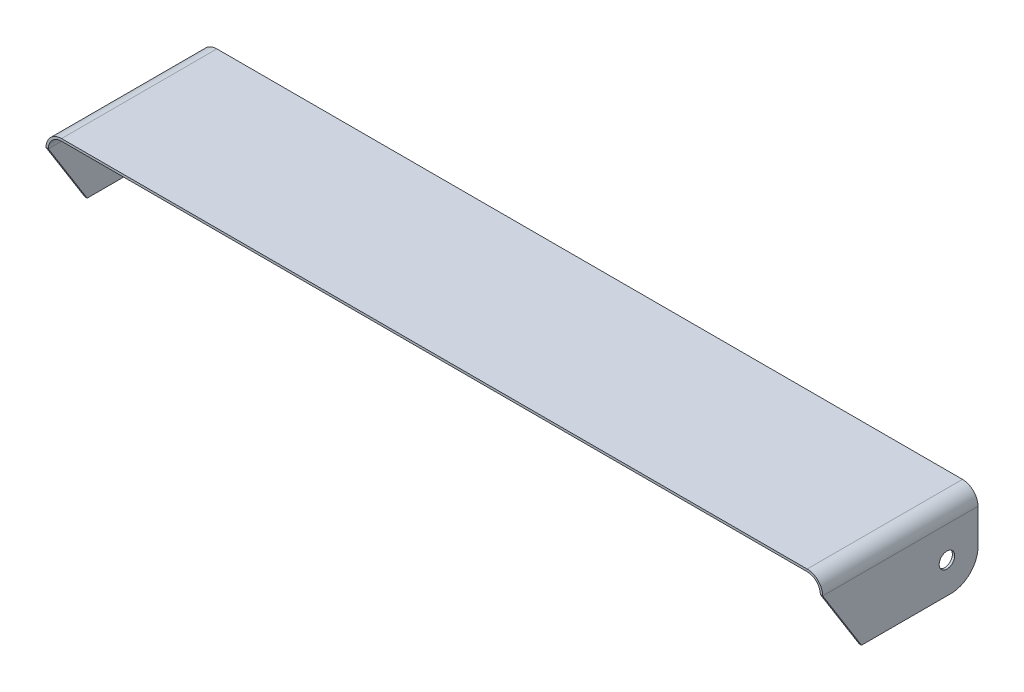
ISO-10303-21;
HEADER;
FILE_DESCRIPTION(('STEP AP214'),'2;1');
FILE_NAME('part.step','',(''),(''),'','','');
FILE_SCHEMA(('AUTOMOTIVE_DESIGN { 1 0 10303 214 1 1 1 1 }'));
ENDSEC;
DATA;
#1=APPLICATION_CONTEXT('core data for automotive mechanical design processes');
#2=APPLICATION_PROTOCOL_DEFINITION('international standard','automotive_design',2000,#1);
#3=PRODUCT_CONTEXT('',#1,'mechanical');
#4=PRODUCT('Part','Part','',(#3));
#5=PRODUCT_RELATED_PRODUCT_CATEGORY('part','',(#4));
#6=PRODUCT_DEFINITION_FORMATION('','',#4);
#7=PRODUCT_DEFINITION_CONTEXT('part definition',#1,'design');
#8=PRODUCT_DEFINITION('design','',#6,#7);
#9=PRODUCT_DEFINITION_SHAPE('','',#8);
#10=(LENGTH_UNIT() NAMED_UNIT(*) SI_UNIT(.MILLI.,.METRE.));
#11=(NAMED_UNIT(*) PLANE_ANGLE_UNIT() SI_UNIT($,.RADIAN.));
#12=(NAMED_UNIT(*) SI_UNIT($,.STERADIAN.) SOLID_ANGLE_UNIT());
#13=UNCERTAINTY_MEASURE_WITH_UNIT(LENGTH_MEASURE(1.E-05),#10,'distance_accuracy_value','');
#14=(GEOMETRIC_REPRESENTATION_CONTEXT(3) GLOBAL_UNCERTAINTY_ASSIGNED_CONTEXT((#13)) GLOBAL_UNIT_ASSIGNED_CONTEXT((#10,
#11,#12)) REPRESENTATION_CONTEXT('',''));
#15=CARTESIAN_POINT('',(0.,0.,0.));
#16=DIRECTION('',(0.,0.,1.));
#17=DIRECTION('',(1.,0.,0.));
#18=AXIS2_PLACEMENT_3D('',#15,#16,#17);
#19=CARTESIAN_POINT('',(-500.,0.,100.));
#20=DIRECTION('',(0.,1.,0.));
#21=DIRECTION('',(0.,0.,1.));
#22=AXIS2_PLACEMENT_3D('',#19,#20,#21);
#23=PLANE('',#22);
#24=DIRECTION('',(0.,0.,-1.));
#25=VECTOR('',#24,1.);
#26=CARTESIAN_POINT('',(-500.,0.,100.));
#27=LINE('',#26,#25);
#28=CARTESIAN_POINT('',(-500.,0.,50.));
#29=VERTEX_POINT('',#28);
#30=CARTESIAN_POINT('',(-500.,0.,-65.));
#31=VERTEX_POINT('',#30);
#32=EDGE_CURVE('E151',#29,#31,#27,.T.);
#33=ORIENTED_EDGE('',*,*,#32,.T.);
#34=DIRECTION('',(1.,0.,0.));
#35=VECTOR('',#34,1.);
#36=CARTESIAN_POINT('',(-497.,0.,-65.));
#37=LINE('',#36,#35);
#38=CARTESIAN_POINT('',(-497.,0.,-65.));
#39=VERTEX_POINT('',#38);
#40=EDGE_CURVE('E210',#31,#39,#37,.T.);
#41=ORIENTED_EDGE('',*,*,#40,.T.);
#42=DIRECTION('',(0.,0.,-1.));
#43=VECTOR('',#42,1.);
#44=CARTESIAN_POINT('',(-497.,0.,100.));
#45=LINE('',#44,#43);
#46=CARTESIAN_POINT('',(-497.,0.,50.));
#47=VERTEX_POINT('',#46);
#48=EDGE_CURVE('E196',#47,#39,#45,.T.);
#49=ORIENTED_EDGE('',*,*,#48,.F.);
#50=DIRECTION('',(1.,0.,0.));
#51=VECTOR('',#50,1.);
#52=CARTESIAN_POINT('',(-500.,0.,50.));
#53=LINE('',#52,#51);
#54=EDGE_CURVE('E226',#29,#47,#53,.T.);
#55=ORIENTED_EDGE('',*,*,#54,.F.);
#56=EDGE_LOOP('',(#33,#41,#49,#55));
#57=FACE_BOUND('',#56,.T.);
#58=ADVANCED_FACE('F33',(#57),#23,.F.);
#59=CARTESIAN_POINT('',(-497.,0.,100.));
#60=DIRECTION('',(-1.,0.,0.));
#61=DIRECTION('',(0.,0.,1.));
#62=AXIS2_PLACEMENT_3D('',#59,#60,#61);
#63=PLANE('',#62);
#64=CARTESIAN_POINT('',(-497.,40.,-60.));
#65=DIRECTION('',(-1.,0.,0.));
#66=DIRECTION('',(0.,0.,1.));
#67=AXIS2_PLACEMENT_3D('',#64,#65,#66);
#68=CIRCLE('',#67,10.);
#69=CARTESIAN_POINT('',(-497.,40.,-50.));
#70=VERTEX_POINT('',#69);
#71=EDGE_CURVE('E327',#70,#70,#68,.T.);
#72=ORIENTED_EDGE('',*,*,#71,.T.);
#73=EDGE_LOOP('',(#72));
#74=FACE_BOUND('',#73,.T.);
#75=ORIENTED_EDGE('',*,*,#48,.T.);
#76=CARTESIAN_POINT('',(-497.,35.,-65.));
#77=DIRECTION('',(-1.,0.,0.));
#78=DIRECTION('',(0.,0.,1.));
#79=AXIS2_PLACEMENT_3D('',#76,#77,#78);
#80=CIRCLE('',#79,35.);
#81=CARTESIAN_POINT('',(-497.,35.,-100.));
#82=VERTEX_POINT('',#81);
#83=EDGE_CURVE('E55',#39,#82,#80,.F.);
#84=ORIENTED_EDGE('',*,*,#83,.T.);
#85=DIRECTION('',(0.,1.,0.));
#86=VECTOR('',#85,1.);
#87=CARTESIAN_POINT('',(-497.,0.,-100.));
#88=LINE('',#87,#86);
#89=CARTESIAN_POINT('',(-497.,79.9999999999999,-100.));
#90=VERTEX_POINT('',#89);
#91=EDGE_CURVE('E220',#82,#90,#88,.T.);
#92=ORIENTED_EDGE('',*,*,#91,.T.);
#93=DIRECTION('',(0.,0.,-1.));
#94=VECTOR('',#93,1.);
#95=CARTESIAN_POINT('',(-497.,79.9999999999999,100.));
#96=LINE('',#95,#94);
#97=CARTESIAN_POINT('',(-497.,79.9999999999999,100.));
#98=VERTEX_POINT('',#97);
#99=EDGE_CURVE('E193',#98,#90,#96,.T.);
#100=ORIENTED_EDGE('',*,*,#99,.F.);
#101=DIRECTION('',(0.,-0.847998304005088,-0.52999894000318));
#102=VECTOR('',#101,1.);
#103=CARTESIAN_POINT('',(-497.,22.4719101123596,64.0449438202247));
#104=LINE('',#103,#102);
#105=EDGE_CURVE('E138',#98,#47,#104,.T.);
#106=ORIENTED_EDGE('',*,*,#105,.T.);
#107=EDGE_LOOP('',(#75,#84,#92,#100,#106));
#108=FACE_BOUND('',#107,.T.);
#109=ADVANCED_FACE('F218',(#74,#108),#63,.F.);
#110=CARTESIAN_POINT('',(-480.,80.,100.));
#111=DIRECTION('',(0.,0.,-1.));
#112=DIRECTION('',(-1.,0.,0.));
#113=AXIS2_PLACEMENT_3D('',#110,#111,#112);
#114=CYLINDRICAL_SURFACE('',#113,17.);
#115=CARTESIAN_POINT('',(-480.,80.,-100.));
#116=DIRECTION('',(0.,0.,-1.));
#117=DIRECTION('',(-1.,0.,0.));
#118=AXIS2_PLACEMENT_3D('',#115,#116,#117);
#119=CIRCLE('',#118,17.);
#120=CARTESIAN_POINT('',(-480.,97.,-100.));
#121=VERTEX_POINT('',#120);
#122=EDGE_CURVE('E223',#90,#121,#119,.T.);
#123=ORIENTED_EDGE('',*,*,#122,.T.);
#124=DIRECTION('',(0.,0.,-1.));
#125=VECTOR('',#124,1.);
#126=CARTESIAN_POINT('',(-480.,97.,100.));
#127=LINE('',#126,#125);
#128=CARTESIAN_POINT('',(-480.,97.,100.));
#129=VERTEX_POINT('',#128);
#130=EDGE_CURVE('E190',#129,#121,#127,.T.);
#131=ORIENTED_EDGE('',*,*,#130,.F.);
#132=CARTESIAN_POINT('',(-480.,80.,100.));
#133=DIRECTION('',(0.,0.,-1.));
#134=DIRECTION('',(-1.,0.,0.));
#135=AXIS2_PLACEMENT_3D('',#132,#133,#134);
#136=CIRCLE('',#135,17.);
#137=EDGE_CURVE('E229',#98,#129,#136,.T.);
#138=ORIENTED_EDGE('',*,*,#137,.F.);
#139=ORIENTED_EDGE('',*,*,#99,.T.);
#140=EDGE_LOOP('',(#123,#131,#138,#139));
#141=FACE_BOUND('',#140,.T.);
#142=ADVANCED_FACE('F266',(#141),#114,.F.);
#143=CARTESIAN_POINT('',(-480.,97.,100.));
#144=DIRECTION('',(0.,1.,0.));
#145=DIRECTION('',(-1.,0.,0.));
#146=AXIS2_PLACEMENT_3D('',#143,#144,#145);
#147=PLANE('',#146);
#148=DIRECTION('',(1.,0.,0.));
#149=VECTOR('',#148,1.);
#150=CARTESIAN_POINT('',(-480.,97.,-100.));
#151=LINE('',#150,#149);
#152=CARTESIAN_POINT('',(480.,97.,-100.));
#153=VERTEX_POINT('',#152);
#154=EDGE_CURVE('E241',#121,#153,#151,.T.);
#155=ORIENTED_EDGE('',*,*,#154,.T.);
#156=DIRECTION('',(0.,0.,-1.));
#157=VECTOR('',#156,1.);
#158=CARTESIAN_POINT('',(480.,97.,100.));
#159=LINE('',#158,#157);
#160=CARTESIAN_POINT('',(480.,97.,100.));
#161=VERTEX_POINT('',#160);
#162=EDGE_CURVE('E187',#161,#153,#159,.T.);
#163=ORIENTED_EDGE('',*,*,#162,.F.);
#164=DIRECTION('',(1.,0.,0.));
#165=VECTOR('',#164,1.);
#166=CARTESIAN_POINT('',(-480.,97.,100.));
#167=LINE('',#166,#165);
#168=EDGE_CURVE('E231',#129,#161,#167,.T.);
#169=ORIENTED_EDGE('',*,*,#168,.F.);
#170=ORIENTED_EDGE('',*,*,#130,.T.);
#171=EDGE_LOOP('',(#155,#163,#169,#170));
#172=FACE_BOUND('',#171,.T.);
#173=ADVANCED_FACE('F272',(#172),#147,.F.);
#174=CARTESIAN_POINT('',(480.,80.,100.));
#175=DIRECTION('',(0.,0.,-1.));
#176=DIRECTION('',(-1.,0.,0.));
#177=AXIS2_PLACEMENT_3D('',#174,#175,#176);
#178=CYLINDRICAL_SURFACE('',#177,17.);
#179=CARTESIAN_POINT('',(480.,80.,-100.));
#180=DIRECTION('',(0.,0.,-1.));
#181=DIRECTION('',(-1.,0.,0.));
#182=AXIS2_PLACEMENT_3D('',#179,#180,#181);
#183=CIRCLE('',#182,17.);
#184=CARTESIAN_POINT('',(497.,79.9999999999999,-100.));
#185=VERTEX_POINT('',#184);
#186=EDGE_CURVE('E243',#153,#185,#183,.T.);
#187=ORIENTED_EDGE('',*,*,#186,.T.);
#188=DIRECTION('',(0.,0.,-1.));
#189=VECTOR('',#188,1.);
#190=CARTESIAN_POINT('',(497.,79.9999999999999,100.));
#191=LINE('',#190,#189);
#192=CARTESIAN_POINT('',(497.,80.,100.));
#193=VERTEX_POINT('',#192);
#194=EDGE_CURVE('E184',#193,#185,#191,.T.);
#195=ORIENTED_EDGE('',*,*,#194,.F.);
#196=CARTESIAN_POINT('',(480.,80.,100.));
#197=DIRECTION('',(0.,0.,-1.));
#198=DIRECTION('',(-1.,0.,0.));
#199=AXIS2_PLACEMENT_3D('',#196,#197,#198);
#200=CIRCLE('',#199,17.);
#201=EDGE_CURVE('E234',#161,#193,#200,.T.);
#202=ORIENTED_EDGE('',*,*,#201,.F.);
#203=ORIENTED_EDGE('',*,*,#162,.T.);
#204=EDGE_LOOP('',(#187,#195,#202,#203));
#205=FACE_BOUND('',#204,.T.);
#206=ADVANCED_FACE('F276',(#205),#178,.F.);
#207=CARTESIAN_POINT('',(497.,79.9999999999999,100.));
#208=DIRECTION('',(1.,0.,0.));
#209=DIRECTION('',(0.,0.,-1.));
#210=AXIS2_PLACEMENT_3D('',#207,#208,#209);
#211=PLANE('',#210);
#212=CARTESIAN_POINT('',(497.,40.,-60.));
#213=DIRECTION('',(1.,0.,0.));
#214=DIRECTION('',(0.,0.,-1.));
#215=AXIS2_PLACEMENT_3D('',#212,#213,#214);
#216=CIRCLE('',#215,10.);
#217=CARTESIAN_POINT('',(497.,40.,-70.));
#218=VERTEX_POINT('',#217);
#219=EDGE_CURVE('E328',#218,#218,#216,.T.);
#220=ORIENTED_EDGE('',*,*,#219,.T.);
#221=EDGE_LOOP('',(#220));
#222=FACE_BOUND('',#221,.T.);
#223=DIRECTION('',(0.,-1.,0.));
#224=VECTOR('',#223,1.);
#225=CARTESIAN_POINT('',(497.,79.9999999999999,-100.));
#226=LINE('',#225,#224);
#227=CARTESIAN_POINT('',(497.,35.,-100.));
#228=VERTEX_POINT('',#227);
#229=EDGE_CURVE('E245',#185,#228,#226,.T.);
#230=ORIENTED_EDGE('',*,*,#229,.T.);
#231=CARTESIAN_POINT('',(497.,35.,-65.));
#232=DIRECTION('',(1.,0.,0.));
#233=DIRECTION('',(0.,0.,-1.));
#234=AXIS2_PLACEMENT_3D('',#231,#232,#233);
#235=CIRCLE('',#234,35.);
#236=CARTESIAN_POINT('',(497.,0.,-65.));
#237=VERTEX_POINT('',#236);
#238=EDGE_CURVE('E208',#228,#237,#235,.F.);
#239=ORIENTED_EDGE('',*,*,#238,.T.);
#240=DIRECTION('',(0.,0.,-1.));
#241=VECTOR('',#240,1.);
#242=CARTESIAN_POINT('',(497.,0.,100.));
#243=LINE('',#242,#241);
#244=CARTESIAN_POINT('',(497.,0.,50.));
#245=VERTEX_POINT('',#244);
#246=EDGE_CURVE('E181',#245,#237,#243,.T.);
#247=ORIENTED_EDGE('',*,*,#246,.F.);
#248=DIRECTION('',(0.,0.847998304005088,0.52999894000318));
#249=VECTOR('',#248,1.);
#250=CARTESIAN_POINT('',(497.,79.9999999999999,100.));
#251=LINE('',#250,#249);
#252=EDGE_CURVE('E221',#245,#193,#251,.T.);
#253=ORIENTED_EDGE('',*,*,#252,.T.);
#254=ORIENTED_EDGE('',*,*,#194,.T.);
#255=EDGE_LOOP('',(#230,#239,#247,#253,#254));
#256=FACE_BOUND('',#255,.T.);
#257=ADVANCED_FACE('F280',(#222,#256),#211,.F.);
#258=CARTESIAN_POINT('',(497.,0.,100.));
#259=DIRECTION('',(0.,1.,0.));
#260=DIRECTION('',(0.,0.,1.));
#261=AXIS2_PLACEMENT_3D('',#258,#259,#260);
#262=PLANE('',#261);
#263=ORIENTED_EDGE('',*,*,#246,.T.);
#264=DIRECTION('',(1.,0.,0.));
#265=VECTOR('',#264,1.);
#266=CARTESIAN_POINT('',(500.,0.,-65.));
#267=LINE('',#266,#265);
#268=CARTESIAN_POINT('',(500.,0.,-65.));
#269=VERTEX_POINT('',#268);
#270=EDGE_CURVE('E201',#237,#269,#267,.T.);
#271=ORIENTED_EDGE('',*,*,#270,.T.);
#272=DIRECTION('',(0.,0.,-1.));
#273=VECTOR('',#272,1.);
#274=CARTESIAN_POINT('',(500.,0.,100.));
#275=LINE('',#274,#273);
#276=CARTESIAN_POINT('',(500.,0.,50.));
#277=VERTEX_POINT('',#276);
#278=EDGE_CURVE('E178',#277,#269,#275,.T.);
#279=ORIENTED_EDGE('',*,*,#278,.F.);
#280=EDGE_CURVE('E142',#245,#277,#53,.T.);
#281=ORIENTED_EDGE('',*,*,#280,.F.);
#282=EDGE_LOOP('',(#263,#271,#279,#281));
#283=FACE_BOUND('',#282,.T.);
#284=ADVANCED_FACE('F284',(#283),#262,.F.);
#285=CARTESIAN_POINT('',(500.,79.9999999999999,100.));
#286=DIRECTION('',(-1.,0.,0.));
#287=DIRECTION('',(0.,0.,1.));
#288=AXIS2_PLACEMENT_3D('',#285,#286,#287);
#289=PLANE('',#288);
#290=CARTESIAN_POINT('',(500.,40.,-60.));
#291=DIRECTION('',(1.,0.,0.));
#292=DIRECTION('',(0.,0.,-1.));
#293=AXIS2_PLACEMENT_3D('',#290,#291,#292);
#294=CIRCLE('',#293,10.);
#295=CARTESIAN_POINT('',(500.,40.,-70.));
#296=VERTEX_POINT('',#295);
#297=EDGE_CURVE('E475',#296,#296,#294,.T.);
#298=ORIENTED_EDGE('',*,*,#297,.F.);
#299=EDGE_LOOP('',(#298));
#300=FACE_BOUND('',#299,.T.);
#301=ORIENTED_EDGE('',*,*,#278,.T.);
#302=CARTESIAN_POINT('',(500.,35.,-65.));
#303=DIRECTION('',(-1.,0.,0.));
#304=DIRECTION('',(0.,0.,1.));
#305=AXIS2_PLACEMENT_3D('',#302,#303,#304);
#306=CIRCLE('',#305,35.);
#307=CARTESIAN_POINT('',(500.,35.,-100.));
#308=VERTEX_POINT('',#307);
#309=EDGE_CURVE('E204',#269,#308,#306,.F.);
#310=ORIENTED_EDGE('',*,*,#309,.T.);
#311=DIRECTION('',(0.,1.,0.));
#312=VECTOR('',#311,1.);
#313=CARTESIAN_POINT('',(500.,79.9999999999999,-100.));
#314=LINE('',#313,#312);
#315=CARTESIAN_POINT('',(500.,79.9999999999999,-100.));
#316=VERTEX_POINT('',#315);
#317=EDGE_CURVE('E248',#308,#316,#314,.T.);
#318=ORIENTED_EDGE('',*,*,#317,.T.);
#319=DIRECTION('',(0.,0.,-1.));
#320=VECTOR('',#319,1.);
#321=CARTESIAN_POINT('',(500.,79.9999999999999,100.));
#322=LINE('',#321,#320);
#323=CARTESIAN_POINT('',(500.,79.9999999999999,100.));
#324=VERTEX_POINT('',#323);
#325=EDGE_CURVE('E175',#324,#316,#322,.T.);
#326=ORIENTED_EDGE('',*,*,#325,.F.);
#327=DIRECTION('',(0.,0.847998304005088,0.52999894000318));
#328=VECTOR('',#327,1.);
#329=CARTESIAN_POINT('',(500.,0.,50.));
#330=LINE('',#329,#328);
#331=EDGE_CURVE('E152',#277,#324,#330,.T.);
#332=ORIENTED_EDGE('',*,*,#331,.F.);
#333=EDGE_LOOP('',(#301,#310,#318,#326,#332));
#334=FACE_BOUND('',#333,.T.);
#335=ADVANCED_FACE('F288',(#300,#334),#289,.F.);
#336=CARTESIAN_POINT('',(480.,80.,100.));
#337=DIRECTION('',(0.,0.,-1.));
#338=DIRECTION('',(-1.,0.,0.));
#339=AXIS2_PLACEMENT_3D('',#336,#337,#338);
#340=CYLINDRICAL_SURFACE('',#339,20.);
#341=CARTESIAN_POINT('',(480.,80.,-100.));
#342=DIRECTION('',(0.,0.,1.));
#343=DIRECTION('',(-1.,0.,0.));
#344=AXIS2_PLACEMENT_3D('',#341,#342,#343);
#345=CIRCLE('',#344,20.);
#346=CARTESIAN_POINT('',(480.,100.,-100.));
#347=VERTEX_POINT('',#346);
#348=EDGE_CURVE('E250',#316,#347,#345,.T.);
#349=ORIENTED_EDGE('',*,*,#348,.T.);
#350=DIRECTION('',(0.,0.,-1.));
#351=VECTOR('',#350,1.);
#352=CARTESIAN_POINT('',(480.,100.,100.));
#353=LINE('',#352,#351);
#354=CARTESIAN_POINT('',(480.,100.,100.));
#355=VERTEX_POINT('',#354);
#356=EDGE_CURVE('E168',#355,#347,#353,.T.);
#357=ORIENTED_EDGE('',*,*,#356,.F.);
#358=CARTESIAN_POINT('',(480.,80.,100.));
#359=DIRECTION('',(0.,0.,1.));
#360=DIRECTION('',(-1.,0.,0.));
#361=AXIS2_PLACEMENT_3D('',#358,#359,#360);
#362=CIRCLE('',#361,20.);
#363=EDGE_CURVE('E237',#324,#355,#362,.T.);
#364=ORIENTED_EDGE('',*,*,#363,.F.);
#365=ORIENTED_EDGE('',*,*,#325,.T.);
#366=EDGE_LOOP('',(#349,#357,#364,#365));
#367=FACE_BOUND('',#366,.T.);
#368=ADVANCED_FACE('F292',(#367),#340,.T.);
#369=CARTESIAN_POINT('',(-480.,100.,100.));
#370=DIRECTION('',(0.,-1.,0.));
#371=DIRECTION('',(0.,0.,-1.));
#372=AXIS2_PLACEMENT_3D('',#369,#370,#371);
#373=PLANE('',#372);
#374=DIRECTION('',(-1.,0.,0.));
#375=VECTOR('',#374,1.);
#376=CARTESIAN_POINT('',(-480.,100.,-100.));
#377=LINE('',#376,#375);
#378=CARTESIAN_POINT('',(-480.,100.,-100.));
#379=VERTEX_POINT('',#378);
#380=EDGE_CURVE('E252',#347,#379,#377,.T.);
#381=ORIENTED_EDGE('',*,*,#380,.T.);
#382=DIRECTION('',(0.,0.,-1.));
#383=VECTOR('',#382,1.);
#384=CARTESIAN_POINT('',(-480.,100.,100.));
#385=LINE('',#384,#383);
#386=CARTESIAN_POINT('',(-480.,100.,100.));
#387=VERTEX_POINT('',#386);
#388=EDGE_CURVE('E166',#387,#379,#385,.T.);
#389=ORIENTED_EDGE('',*,*,#388,.F.);
#390=DIRECTION('',(-1.,0.,0.));
#391=VECTOR('',#390,1.);
#392=CARTESIAN_POINT('',(-480.,100.,100.));
#393=LINE('',#392,#391);
#394=EDGE_CURVE('E158',#355,#387,#393,.T.);
#395=ORIENTED_EDGE('',*,*,#394,.F.);
#396=ORIENTED_EDGE('',*,*,#356,.T.);
#397=EDGE_LOOP('',(#381,#389,#395,#396));
#398=FACE_BOUND('',#397,.T.);
#399=ADVANCED_FACE('F296',(#398),#373,.F.);
#400=CARTESIAN_POINT('',(-480.,80.,100.));
#401=DIRECTION('',(0.,0.,-1.));
#402=DIRECTION('',(-1.,0.,0.));
#403=AXIS2_PLACEMENT_3D('',#400,#401,#402);
#404=CYLINDRICAL_SURFACE('',#403,20.);
#405=CARTESIAN_POINT('',(-480.,80.,-100.));
#406=DIRECTION('',(0.,0.,1.));
#407=DIRECTION('',(-1.,0.,0.));
#408=AXIS2_PLACEMENT_3D('',#405,#406,#407);
#409=CIRCLE('',#408,20.);
#410=CARTESIAN_POINT('',(-500.,79.9999999999999,-100.));
#411=VERTEX_POINT('',#410);
#412=EDGE_CURVE('E165',#379,#411,#409,.T.);
#413=ORIENTED_EDGE('',*,*,#412,.T.);
#414=DIRECTION('',(0.,0.,-1.));
#415=VECTOR('',#414,1.);
#416=CARTESIAN_POINT('',(-500.,79.9999999999999,100.));
#417=LINE('',#416,#415);
#418=CARTESIAN_POINT('',(-500.,80.,100.));
#419=VERTEX_POINT('',#418);
#420=EDGE_CURVE('E149',#419,#411,#417,.T.);
#421=ORIENTED_EDGE('',*,*,#420,.F.);
#422=CARTESIAN_POINT('',(-480.,80.,100.));
#423=DIRECTION('',(0.,0.,1.));
#424=DIRECTION('',(-1.,0.,0.));
#425=AXIS2_PLACEMENT_3D('',#422,#423,#424);
#426=CIRCLE('',#425,20.);
#427=EDGE_CURVE('E155',#387,#419,#426,.T.);
#428=ORIENTED_EDGE('',*,*,#427,.F.);
#429=ORIENTED_EDGE('',*,*,#388,.T.);
#430=EDGE_LOOP('',(#413,#421,#428,#429));
#431=FACE_BOUND('',#430,.T.);
#432=ADVANCED_FACE('F163',(#431),#404,.T.);
#433=CARTESIAN_POINT('',(-500.,0.,100.));
#434=DIRECTION('',(1.,0.,0.));
#435=DIRECTION('',(0.,0.,-1.));
#436=AXIS2_PLACEMENT_3D('',#433,#434,#435);
#437=PLANE('',#436);
#438=CARTESIAN_POINT('',(-500.,40.,-60.));
#439=DIRECTION('',(1.,0.,0.));
#440=DIRECTION('',(0.,0.,-1.));
#441=AXIS2_PLACEMENT_3D('',#438,#439,#440);
#442=CIRCLE('',#441,10.);
#443=CARTESIAN_POINT('',(-500.,40.,-70.));
#444=VERTEX_POINT('',#443);
#445=EDGE_CURVE('E324',#444,#444,#442,.T.);
#446=ORIENTED_EDGE('',*,*,#445,.T.);
#447=EDGE_LOOP('',(#446));
#448=FACE_BOUND('',#447,.T.);
#449=DIRECTION('',(0.,-1.,0.));
#450=VECTOR('',#449,1.);
#451=CARTESIAN_POINT('',(-500.,0.,-100.));
#452=LINE('',#451,#450);
#453=CARTESIAN_POINT('',(-500.,35.,-100.));
#454=VERTEX_POINT('',#453);
#455=EDGE_CURVE('E232',#411,#454,#452,.T.);
#456=ORIENTED_EDGE('',*,*,#455,.T.);
#457=CARTESIAN_POINT('',(-500.,35.,-65.));
#458=DIRECTION('',(1.,0.,0.));
#459=DIRECTION('',(0.,0.,-1.));
#460=AXIS2_PLACEMENT_3D('',#457,#458,#459);
#461=CIRCLE('',#460,35.);
#462=EDGE_CURVE('E11',#454,#31,#461,.F.);
#463=ORIENTED_EDGE('',*,*,#462,.T.);
#464=ORIENTED_EDGE('',*,*,#32,.F.);
#465=DIRECTION('',(0.,0.847998304005088,0.52999894000318));
#466=VECTOR('',#465,1.);
#467=CARTESIAN_POINT('',(-500.,0.,50.));
#468=LINE('',#467,#466);
#469=EDGE_CURVE('E135',#29,#419,#468,.T.);
#470=ORIENTED_EDGE('',*,*,#469,.T.);
#471=ORIENTED_EDGE('',*,*,#420,.T.);
#472=EDGE_LOOP('',(#456,#463,#464,#470,#471));
#473=FACE_BOUND('',#472,.T.);
#474=ADVANCED_FACE('F147',(#448,#473),#437,.F.);
#475=CARTESIAN_POINT('',(-480.,80.,100.));
#476=DIRECTION('',(0.,0.,-1.));
#477=DIRECTION('',(-1.,0.,0.));
#478=AXIS2_PLACEMENT_3D('',#475,#476,#477);
#479=PLANE('',#478);
#480=ORIENTED_EDGE('',*,*,#427,.T.);
#481=DIRECTION('',(1.,0.,0.));
#482=VECTOR('',#481,1.);
#483=CARTESIAN_POINT('',(-500.,80.,100.));
#484=LINE('',#483,#482);
#485=EDGE_CURVE('E132',#419,#98,#484,.T.);
#486=ORIENTED_EDGE('',*,*,#485,.T.);
#487=ORIENTED_EDGE('',*,*,#137,.T.);
#488=ORIENTED_EDGE('',*,*,#168,.T.);
#489=ORIENTED_EDGE('',*,*,#201,.T.);
#490=DIRECTION('',(1.,0.,0.));
#491=VECTOR('',#490,1.);
#492=CARTESIAN_POINT('',(-480.,80.,100.));
#493=LINE('',#492,#491);
#494=EDGE_CURVE('E198',#193,#324,#493,.T.);
#495=ORIENTED_EDGE('',*,*,#494,.T.);
#496=ORIENTED_EDGE('',*,*,#363,.T.);
#497=ORIENTED_EDGE('',*,*,#394,.T.);
#498=EDGE_LOOP('',(#480,#486,#487,#488,#489,#495,#496,#497));
#499=FACE_BOUND('',#498,.T.);
#500=ADVANCED_FACE('F156',(#499),#479,.F.);
#501=CARTESIAN_POINT('',(-480.,80.,-100.));
#502=DIRECTION('',(0.,0.,-1.));
#503=DIRECTION('',(-1.,0.,0.));
#504=AXIS2_PLACEMENT_3D('',#501,#502,#503);
#505=PLANE('',#504);
#506=ORIENTED_EDGE('',*,*,#91,.F.);
#507=DIRECTION('',(1.,0.,0.));
#508=VECTOR('',#507,1.);
#509=CARTESIAN_POINT('',(-500.,35.,-100.));
#510=LINE('',#509,#508);
#511=EDGE_CURVE('E41',#82,#454,#510,.F.);
#512=ORIENTED_EDGE('',*,*,#511,.T.);
#513=ORIENTED_EDGE('',*,*,#455,.F.);
#514=ORIENTED_EDGE('',*,*,#412,.F.);
#515=ORIENTED_EDGE('',*,*,#380,.F.);
#516=ORIENTED_EDGE('',*,*,#348,.F.);
#517=ORIENTED_EDGE('',*,*,#317,.F.);
#518=DIRECTION('',(1.,0.,0.));
#519=VECTOR('',#518,1.);
#520=CARTESIAN_POINT('',(497.,35.,-100.));
#521=LINE('',#520,#519);
#522=EDGE_CURVE('E206',#308,#228,#521,.F.);
#523=ORIENTED_EDGE('',*,*,#522,.T.);
#524=ORIENTED_EDGE('',*,*,#229,.F.);
#525=ORIENTED_EDGE('',*,*,#186,.F.);
#526=ORIENTED_EDGE('',*,*,#154,.F.);
#527=ORIENTED_EDGE('',*,*,#122,.F.);
#528=EDGE_LOOP('',(#506,#512,#513,#514,#515,#516,#517,#523,#524,#525,#526,#527));
#529=FACE_BOUND('',#528,.T.);
#530=ADVANCED_FACE('F306',(#529),#505,.T.);
#531=CARTESIAN_POINT('',(-500.,0.,50.));
#532=DIRECTION('',(0.,0.52999894000318,-0.847998304005088));
#533=DIRECTION('',(0.,0.847998304005088,0.52999894000318));
#534=AXIS2_PLACEMENT_3D('',#531,#532,#533);
#535=PLANE('',#534);
#536=ORIENTED_EDGE('',*,*,#280,.T.);
#537=ORIENTED_EDGE('',*,*,#331,.T.);
#538=ORIENTED_EDGE('',*,*,#494,.F.);
#539=ORIENTED_EDGE('',*,*,#252,.F.);
#540=EDGE_LOOP('',(#536,#537,#538,#539));
#541=FACE_BOUND('',#540,.T.);
#542=ADVANCED_FACE('F309',(#541),#535,.F.);
#543=ORIENTED_EDGE('',*,*,#485,.F.);
#544=ORIENTED_EDGE('',*,*,#469,.F.);
#545=ORIENTED_EDGE('',*,*,#54,.T.);
#546=ORIENTED_EDGE('',*,*,#105,.F.);
#547=EDGE_LOOP('',(#543,#544,#545,#546));
#548=FACE_BOUND('',#547,.T.);
#549=ADVANCED_FACE('F134',(#548),#535,.F.);
#550=CARTESIAN_POINT('',(-500.,40.,-60.));
#551=DIRECTION('',(1.,0.,0.));
#552=DIRECTION('',(0.,0.,-1.));
#553=AXIS2_PLACEMENT_3D('',#550,#551,#552);
#554=CYLINDRICAL_SURFACE('',#553,10.);
#555=ORIENTED_EDGE('',*,*,#445,.F.);
#556=EDGE_LOOP('',(#555));
#557=FACE_BOUND('',#556,.T.);
#558=ORIENTED_EDGE('',*,*,#71,.F.);
#559=EDGE_LOOP('',(#558));
#560=FACE_BOUND('',#559,.T.);
#561=ADVANCED_FACE('F314',(#557,#560),#554,.F.);
#562=ORIENTED_EDGE('',*,*,#297,.T.);
#563=EDGE_LOOP('',(#562));
#564=FACE_BOUND('',#563,.T.);
#565=ORIENTED_EDGE('',*,*,#219,.F.);
#566=EDGE_LOOP('',(#565));
#567=FACE_BOUND('',#566,.T.);
#568=ADVANCED_FACE('F259',(#564,#567),#554,.F.);
#569=CARTESIAN_POINT('',(497.,35.,-65.));
#570=DIRECTION('',(-1.,0.,0.));
#571=DIRECTION('',(0.,0.,1.));
#572=AXIS2_PLACEMENT_3D('',#569,#570,#571);
#573=CYLINDRICAL_SURFACE('',#572,35.);
#574=ORIENTED_EDGE('',*,*,#238,.F.);
#575=ORIENTED_EDGE('',*,*,#522,.F.);
#576=ORIENTED_EDGE('',*,*,#309,.F.);
#577=ORIENTED_EDGE('',*,*,#270,.F.);
#578=EDGE_LOOP('',(#574,#575,#576,#577));
#579=FACE_BOUND('',#578,.T.);
#580=ADVANCED_FACE('F255',(#579),#573,.T.);
#581=CARTESIAN_POINT('',(-500.,35.,-65.));
#582=DIRECTION('',(-1.,0.,0.));
#583=DIRECTION('',(0.,0.,1.));
#584=AXIS2_PLACEMENT_3D('',#581,#582,#583);
#585=CYLINDRICAL_SURFACE('',#584,35.);
#586=ORIENTED_EDGE('',*,*,#462,.F.);
#587=ORIENTED_EDGE('',*,*,#511,.F.);
#588=ORIENTED_EDGE('',*,*,#83,.F.);
#589=ORIENTED_EDGE('',*,*,#40,.F.);
#590=EDGE_LOOP('',(#586,#587,#588,#589));
#591=FACE_BOUND('',#590,.T.);
#592=ADVANCED_FACE('F35',(#591),#585,.T.);
#593=CLOSED_SHELL('',(#58,#109,#142,#173,#206,#257,#284,#335,#368,#399,#432,#474,#500,#530,#542,
#549,#561,#568,#580,#592));
#594=MANIFOLD_SOLID_BREP('B2',#593);
#595=ADVANCED_BREP_SHAPE_REPRESENTATION('',(#18,#594),#14);
#596=SHAPE_DEFINITION_REPRESENTATION(#9,#595);
ENDSEC;
END-ISO-10303-21;
